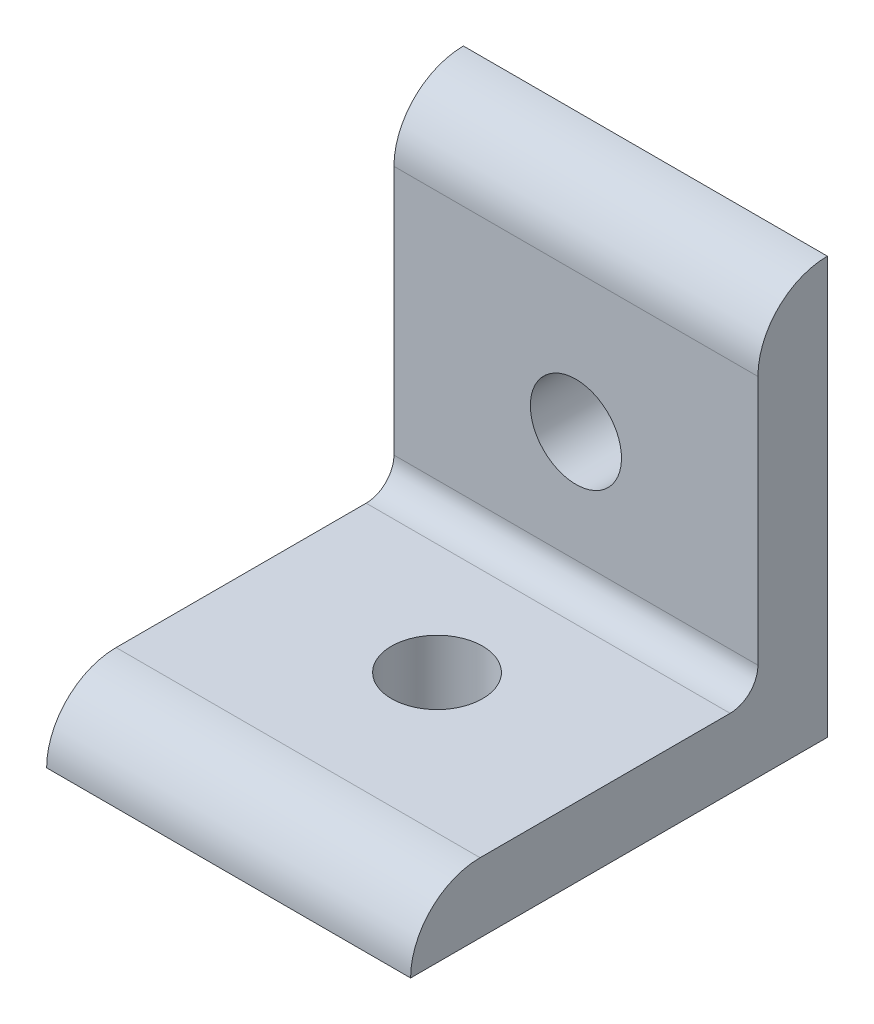
ISO-10303-21;
HEADER;
FILE_DESCRIPTION(('STEP AP214'),'2;1');
FILE_NAME('part.step','',(''),(''),'','','');
FILE_SCHEMA(('AUTOMOTIVE_DESIGN { 1 0 10303 214 1 1 1 1 }'));
ENDSEC;
DATA;
#1=APPLICATION_CONTEXT('core data for automotive mechanical design processes');
#2=APPLICATION_PROTOCOL_DEFINITION('international standard','automotive_design',2000,#1);
#3=PRODUCT_CONTEXT('',#1,'mechanical');
#4=PRODUCT('Part','Part','',(#3));
#5=PRODUCT_RELATED_PRODUCT_CATEGORY('part','',(#4));
#6=PRODUCT_DEFINITION_FORMATION('','',#4);
#7=PRODUCT_DEFINITION_CONTEXT('part definition',#1,'design');
#8=PRODUCT_DEFINITION('design','',#6,#7);
#9=PRODUCT_DEFINITION_SHAPE('','',#8);
#10=(LENGTH_UNIT() NAMED_UNIT(*) SI_UNIT(.MILLI.,.METRE.));
#11=(NAMED_UNIT(*) PLANE_ANGLE_UNIT() SI_UNIT($,.RADIAN.));
#12=(NAMED_UNIT(*) SI_UNIT($,.STERADIAN.) SOLID_ANGLE_UNIT());
#13=UNCERTAINTY_MEASURE_WITH_UNIT(LENGTH_MEASURE(1.E-05),#10,'distance_accuracy_value','');
#14=(GEOMETRIC_REPRESENTATION_CONTEXT(3) GLOBAL_UNCERTAINTY_ASSIGNED_CONTEXT((#13)) GLOBAL_UNIT_ASSIGNED_CONTEXT((#10,
#11,#12)) REPRESENTATION_CONTEXT('',''));
#15=CARTESIAN_POINT('',(0.,0.,0.));
#16=DIRECTION('',(0.,0.,1.));
#17=DIRECTION('',(1.,0.,0.));
#18=AXIS2_PLACEMENT_3D('',#15,#16,#17);
#19=CARTESIAN_POINT('',(-16.6178382583052,8.81215661344187,8.95617811660636));
#20=DIRECTION('',(1.,0.,0.));
#21=DIRECTION('',(0.,0.,-1.));
#22=AXIS2_PLACEMENT_3D('',#19,#20,#21);
#23=CYLINDRICAL_SURFACE('',#22,2.54);
#24=DIRECTION('',(1.,0.,0.));
#25=VECTOR('',#24,1.);
#26=CARTESIAN_POINT('',(-16.6178382583052,8.81215661344188,6.41617811660636));
#27=LINE('',#26,#25);
#28=CARTESIAN_POINT('',(-16.6178382583052,8.81215661344187,6.41617811660636));
#29=VERTEX_POINT('',#28);
#30=CARTESIAN_POINT('',(16.6561617416948,8.81215661344187,6.41617811660636));
#31=VERTEX_POINT('',#30);
#32=EDGE_CURVE('E10',#29,#31,#27,.T.);
#33=ORIENTED_EDGE('',*,*,#32,.F.);
#34=CARTESIAN_POINT('',(-16.6178382583052,8.81215661344187,8.95617811660636));
#35=DIRECTION('',(1.,0.,0.));
#36=DIRECTION('',(0.,0.,-1.));
#37=AXIS2_PLACEMENT_3D('',#34,#35,#36);
#38=CIRCLE('',#37,2.54);
#39=CARTESIAN_POINT('',(-16.6178382583052,6.27215661344187,8.95617811660636));
#40=VERTEX_POINT('',#39);
#41=EDGE_CURVE('E154',#40,#29,#38,.T.);
#42=ORIENTED_EDGE('',*,*,#41,.F.);
#43=DIRECTION('',(-1.,0.,0.));
#44=VECTOR('',#43,1.);
#45=CARTESIAN_POINT('',(-16.6178382583052,6.27215661344187,8.95617811660636));
#46=LINE('',#45,#44);
#47=CARTESIAN_POINT('',(16.6561617416948,6.27215661344187,8.95617811660636));
#48=VERTEX_POINT('',#47);
#49=EDGE_CURVE('E26',#48,#40,#46,.T.);
#50=ORIENTED_EDGE('',*,*,#49,.F.);
#51=CARTESIAN_POINT('',(16.6561617416948,8.81215661344187,8.95617811660636));
#52=DIRECTION('',(1.,0.,0.));
#53=DIRECTION('',(0.,0.,-1.));
#54=AXIS2_PLACEMENT_3D('',#51,#52,#53);
#55=CIRCLE('',#54,2.54);
#56=EDGE_CURVE('E140',#48,#31,#55,.T.);
#57=ORIENTED_EDGE('',*,*,#56,.T.);
#58=EDGE_LOOP('',(#33,#42,#50,#57));
#59=FACE_BOUND('',#58,.T.);
#60=ADVANCED_FACE('F16',(#59),#23,.F.);
#61=CARTESIAN_POINT('',(-16.6178382583052,8.81215661344188,6.41617811660636));
#62=DIRECTION('',(0.,0.,1.));
#63=DIRECTION('',(0.,-1.,0.));
#64=AXIS2_PLACEMENT_3D('',#61,#62,#63);
#65=PLANE('',#64);
#66=CARTESIAN_POINT('',(0.019161741694791,18.9721566134419,6.4161781166064));
#67=DIRECTION('',(0.,0.,-1.));
#68=DIRECTION('',(0.,1.,0.));
#69=AXIS2_PLACEMENT_3D('',#66,#67,#68);
#70=CIRCLE('',#69,4.1656);
#71=CARTESIAN_POINT('',(0.019161741694791,23.1377566134418,6.41617811660642));
#72=VERTEX_POINT('',#71);
#73=EDGE_CURVE('E169',#72,#72,#70,.T.);
#74=ORIENTED_EDGE('',*,*,#73,.T.);
#75=EDGE_LOOP('',(#74));
#76=FACE_BOUND('',#75,.T.);
#77=DIRECTION('',(0.,1.,0.));
#78=VECTOR('',#77,1.);
#79=CARTESIAN_POINT('',(-16.6178382583052,8.81215661344187,6.41617811660636));
#80=LINE('',#79,#78);
#81=CARTESIAN_POINT('',(-16.6178382583052,31.6721566134419,6.41617811660641));
#82=VERTEX_POINT('',#81);
#83=EDGE_CURVE('E145',#29,#82,#80,.T.);
#84=ORIENTED_EDGE('',*,*,#83,.F.);
#85=ORIENTED_EDGE('',*,*,#32,.T.);
#86=DIRECTION('',(0.,1.,0.));
#87=VECTOR('',#86,1.);
#88=CARTESIAN_POINT('',(16.6561617416948,8.81215661344187,6.41617811660636));
#89=LINE('',#88,#87);
#90=CARTESIAN_POINT('',(16.6561617416948,31.6721566134419,6.41617811660641));
#91=VERTEX_POINT('',#90);
#92=EDGE_CURVE('E146',#31,#91,#89,.T.);
#93=ORIENTED_EDGE('',*,*,#92,.T.);
#94=DIRECTION('',(1.,0.,0.));
#95=VECTOR('',#94,1.);
#96=CARTESIAN_POINT('',(-16.6178382583052,31.6721566134419,6.41617811660645));
#97=LINE('',#96,#95);
#98=EDGE_CURVE('E138',#82,#91,#97,.T.);
#99=ORIENTED_EDGE('',*,*,#98,.F.);
#100=EDGE_LOOP('',(#84,#85,#93,#99));
#101=FACE_BOUND('',#100,.T.);
#102=ADVANCED_FACE('F228',(#76,#101),#65,.T.);
#103=CARTESIAN_POINT('',(-16.6178382583052,6.27215661344187,31.8161781166063));
#104=DIRECTION('',(0.,1.,0.));
#105=DIRECTION('',(1.,0.,0.));
#106=AXIS2_PLACEMENT_3D('',#103,#104,#105);
#107=PLANE('',#106);
#108=CARTESIAN_POINT('',(0.019161741694791,6.27215661344187,19.1161781166063));
#109=DIRECTION('',(0.,-1.,0.));
#110=DIRECTION('',(0.,0.,-1.));
#111=AXIS2_PLACEMENT_3D('',#108,#109,#110);
#112=CIRCLE('',#111,4.1656);
#113=CARTESIAN_POINT('',(0.019161741694791,6.27215661344187,14.9505781166063));
#114=VERTEX_POINT('',#113);
#115=EDGE_CURVE('E170',#114,#114,#112,.T.);
#116=ORIENTED_EDGE('',*,*,#115,.T.);
#117=EDGE_LOOP('',(#116));
#118=FACE_BOUND('',#117,.T.);
#119=DIRECTION('',(0.,0.,-1.));
#120=VECTOR('',#119,1.);
#121=CARTESIAN_POINT('',(-16.6178382583052,6.27215661344187,8.95617811660636));
#122=LINE('',#121,#120);
#123=CARTESIAN_POINT('',(-16.6178382583052,6.27215661344187,31.8161781166063));
#124=VERTEX_POINT('',#123);
#125=EDGE_CURVE('E150',#124,#40,#122,.T.);
#126=ORIENTED_EDGE('',*,*,#125,.F.);
#127=DIRECTION('',(-1.,0.,0.));
#128=VECTOR('',#127,1.);
#129=CARTESIAN_POINT('',(-16.6178382583052,6.27215661344187,31.8161781166063));
#130=LINE('',#129,#128);
#131=CARTESIAN_POINT('',(16.6561617416948,6.27215661344187,31.8161781166063));
#132=VERTEX_POINT('',#131);
#133=EDGE_CURVE('E162',#132,#124,#130,.T.);
#134=ORIENTED_EDGE('',*,*,#133,.F.);
#135=DIRECTION('',(0.,0.,-1.));
#136=VECTOR('',#135,1.);
#137=CARTESIAN_POINT('',(16.6561617416948,6.27215661344187,8.95617811660636));
#138=LINE('',#137,#136);
#139=EDGE_CURVE('E158',#132,#48,#138,.T.);
#140=ORIENTED_EDGE('',*,*,#139,.T.);
#141=ORIENTED_EDGE('',*,*,#49,.T.);
#142=EDGE_LOOP('',(#126,#134,#140,#141));
#143=FACE_BOUND('',#142,.T.);
#144=ADVANCED_FACE('F197',(#118,#143),#107,.T.);
#145=CARTESIAN_POINT('',(-16.6178382583052,31.6721566134419,0.0661781166064482));
#146=DIRECTION('',(1.,0.,0.));
#147=DIRECTION('',(0.,0.,-1.));
#148=AXIS2_PLACEMENT_3D('',#145,#146,#147);
#149=CYLINDRICAL_SURFACE('',#148,6.35);
#150=CARTESIAN_POINT('',(-16.6178382583052,31.6721566134419,0.0661781166064482));
#151=DIRECTION('',(-1.,0.,0.));
#152=DIRECTION('',(0.,0.,-1.));
#153=AXIS2_PLACEMENT_3D('',#150,#151,#152);
#154=CIRCLE('',#153,6.35);
#155=CARTESIAN_POINT('',(-16.6178382583052,38.0221566134419,0.0661781166064754));
#156=VERTEX_POINT('',#155);
#157=EDGE_CURVE('E141',#82,#156,#154,.T.);
#158=ORIENTED_EDGE('',*,*,#157,.F.);
#159=ORIENTED_EDGE('',*,*,#98,.T.);
#160=CARTESIAN_POINT('',(16.6561617416948,31.6721566134419,0.0661781166064482));
#161=DIRECTION('',(-1.,0.,0.));
#162=DIRECTION('',(0.,0.,-1.));
#163=AXIS2_PLACEMENT_3D('',#160,#161,#162);
#164=CIRCLE('',#163,6.35);
#165=CARTESIAN_POINT('',(16.6561617416948,38.0221566134419,0.0661781166064754));
#166=VERTEX_POINT('',#165);
#167=EDGE_CURVE('E149',#91,#166,#164,.T.);
#168=ORIENTED_EDGE('',*,*,#167,.T.);
#169=DIRECTION('',(1.,0.,0.));
#170=VECTOR('',#169,1.);
#171=CARTESIAN_POINT('',(-16.6178382583052,38.0221566134419,0.0661781166064754));
#172=LINE('',#171,#170);
#173=EDGE_CURVE('E97',#156,#166,#172,.T.);
#174=ORIENTED_EDGE('',*,*,#173,.F.);
#175=EDGE_LOOP('',(#158,#159,#168,#174));
#176=FACE_BOUND('',#175,.T.);
#177=ADVANCED_FACE('F226',(#176),#149,.T.);
#178=CARTESIAN_POINT('',(16.6561617416948,8.81215661344187,8.95617811660636));
#179=DIRECTION('',(-1.,0.,0.));
#180=DIRECTION('',(0.,0.,1.));
#181=AXIS2_PLACEMENT_3D('',#178,#179,#180);
#182=PLANE('',#181);
#183=ORIENTED_EDGE('',*,*,#139,.F.);
#184=CARTESIAN_POINT('',(16.6561617416948,-0.0778433865581301,31.8161781166063));
#185=DIRECTION('',(-1.,0.,0.));
#186=DIRECTION('',(0.,0.,-1.));
#187=AXIS2_PLACEMENT_3D('',#184,#185,#186);
#188=CIRCLE('',#187,6.35);
#189=CARTESIAN_POINT('',(16.6561617416948,-0.0778433865581301,38.1661781166064));
#190=VERTEX_POINT('',#189);
#191=EDGE_CURVE('E108',#190,#132,#188,.T.);
#192=ORIENTED_EDGE('',*,*,#191,.F.);
#193=DIRECTION('',(0.,0.,1.));
#194=VECTOR('',#193,1.);
#195=CARTESIAN_POINT('',(16.6561617416948,-0.0778433865581301,38.1661781166064));
#196=LINE('',#195,#194);
#197=CARTESIAN_POINT('',(16.6561617416948,-0.0778433865581301,0.0661781166063284));
#198=VERTEX_POINT('',#197);
#199=EDGE_CURVE('E104',#198,#190,#196,.T.);
#200=ORIENTED_EDGE('',*,*,#199,.F.);
#201=DIRECTION('',(0.,-1.,0.));
#202=VECTOR('',#201,1.);
#203=CARTESIAN_POINT('',(16.6561617416948,38.0221566134419,0.0661781166064754));
#204=LINE('',#203,#202);
#205=EDGE_CURVE('E89',#166,#198,#204,.T.);
#206=ORIENTED_EDGE('',*,*,#205,.F.);
#207=ORIENTED_EDGE('',*,*,#167,.F.);
#208=ORIENTED_EDGE('',*,*,#92,.F.);
#209=ORIENTED_EDGE('',*,*,#56,.F.);
#210=EDGE_LOOP('',(#183,#192,#200,#206,#207,#208,#209));
#211=FACE_BOUND('',#210,.T.);
#212=ADVANCED_FACE('F106',(#211),#182,.F.);
#213=CARTESIAN_POINT('',(-16.6178382583052,-0.0778433865581301,31.8161781166063));
#214=DIRECTION('',(1.,0.,0.));
#215=DIRECTION('',(0.,0.,-1.));
#216=AXIS2_PLACEMENT_3D('',#213,#214,#215);
#217=CYLINDRICAL_SURFACE('',#216,6.35);
#218=CARTESIAN_POINT('',(-16.6178382583052,-0.0778433865581301,31.8161781166063));
#219=DIRECTION('',(-1.,0.,0.));
#220=DIRECTION('',(0.,0.,-1.));
#221=AXIS2_PLACEMENT_3D('',#218,#219,#220);
#222=CIRCLE('',#221,6.35);
#223=CARTESIAN_POINT('',(-16.6178382583052,-0.0778433865581301,38.1661781166064));
#224=VERTEX_POINT('',#223);
#225=EDGE_CURVE('E101',#224,#124,#222,.T.);
#226=ORIENTED_EDGE('',*,*,#225,.F.);
#227=DIRECTION('',(-1.,0.,0.));
#228=VECTOR('',#227,1.);
#229=CARTESIAN_POINT('',(-16.6178382583052,-0.0778433865581301,38.1661781166064));
#230=LINE('',#229,#228);
#231=EDGE_CURVE('E113',#190,#224,#230,.T.);
#232=ORIENTED_EDGE('',*,*,#231,.F.);
#233=ORIENTED_EDGE('',*,*,#191,.T.);
#234=ORIENTED_EDGE('',*,*,#133,.T.);
#235=EDGE_LOOP('',(#226,#232,#233,#234));
#236=FACE_BOUND('',#235,.T.);
#237=ADVANCED_FACE('F205',(#236),#217,.T.);
#238=CARTESIAN_POINT('',(-16.6178382583052,8.81215661344187,8.95617811660636));
#239=DIRECTION('',(-1.,0.,0.));
#240=DIRECTION('',(0.,0.,1.));
#241=AXIS2_PLACEMENT_3D('',#238,#239,#240);
#242=PLANE('',#241);
#243=ORIENTED_EDGE('',*,*,#225,.T.);
#244=ORIENTED_EDGE('',*,*,#125,.T.);
#245=ORIENTED_EDGE('',*,*,#41,.T.);
#246=ORIENTED_EDGE('',*,*,#83,.T.);
#247=ORIENTED_EDGE('',*,*,#157,.T.);
#248=DIRECTION('',(0.,1.,0.));
#249=VECTOR('',#248,1.);
#250=CARTESIAN_POINT('',(-16.6178382583052,38.0221566134419,0.0661781166064754));
#251=LINE('',#250,#249);
#252=CARTESIAN_POINT('',(-16.6178382583052,-0.0778433865581301,0.0661781166063284));
#253=VERTEX_POINT('',#252);
#254=EDGE_CURVE('E19',#253,#156,#251,.T.);
#255=ORIENTED_EDGE('',*,*,#254,.F.);
#256=DIRECTION('',(0.,0.,-1.));
#257=VECTOR('',#256,1.);
#258=CARTESIAN_POINT('',(-16.6178382583052,-0.0778433865581301,38.1661781166064));
#259=LINE('',#258,#257);
#260=EDGE_CURVE('E117',#224,#253,#259,.T.);
#261=ORIENTED_EDGE('',*,*,#260,.F.);
#262=EDGE_LOOP('',(#243,#244,#245,#246,#247,#255,#261));
#263=FACE_BOUND('',#262,.T.);
#264=ADVANCED_FACE('F202',(#263),#242,.T.);
#265=CARTESIAN_POINT('',(-16.6178382583052,38.0221566134419,0.0661781166064754));
#266=DIRECTION('',(0.,0.,-1.));
#267=DIRECTION('',(-1.,0.,0.));
#268=AXIS2_PLACEMENT_3D('',#265,#266,#267);
#269=PLANE('',#268);
#270=CARTESIAN_POINT('',(0.019161741694791,18.9721566134419,0.0661781166064047));
#271=DIRECTION('',(0.,0.,1.));
#272=DIRECTION('',(0.,1.,0.));
#273=AXIS2_PLACEMENT_3D('',#270,#271,#272);
#274=CIRCLE('',#273,4.1656);
#275=CARTESIAN_POINT('',(0.019161741694791,23.1377566134418,0.0661781166064208));
#276=VERTEX_POINT('',#275);
#277=EDGE_CURVE('E124',#276,#276,#274,.T.);
#278=ORIENTED_EDGE('',*,*,#277,.T.);
#279=EDGE_LOOP('',(#278));
#280=FACE_BOUND('',#279,.T.);
#281=ORIENTED_EDGE('',*,*,#254,.T.);
#282=ORIENTED_EDGE('',*,*,#173,.T.);
#283=ORIENTED_EDGE('',*,*,#205,.T.);
#284=DIRECTION('',(1.,0.,0.));
#285=VECTOR('',#284,1.);
#286=CARTESIAN_POINT('',(-16.6178382583052,-0.0778433865581301,0.0661781166063284));
#287=LINE('',#286,#285);
#288=EDGE_CURVE('E94',#253,#198,#287,.T.);
#289=ORIENTED_EDGE('',*,*,#288,.F.);
#290=EDGE_LOOP('',(#281,#282,#283,#289));
#291=FACE_BOUND('',#290,.T.);
#292=ADVANCED_FACE('F92',(#280,#291),#269,.T.);
#293=CARTESIAN_POINT('',(-16.6178382583052,-0.0778433865581301,38.1661781166064));
#294=DIRECTION('',(0.,-1.,0.));
#295=DIRECTION('',(0.,0.,-1.));
#296=AXIS2_PLACEMENT_3D('',#293,#294,#295);
#297=PLANE('',#296);
#298=CARTESIAN_POINT('',(0.019161741694791,-0.0778433865581301,19.1161781166063));
#299=DIRECTION('',(0.,1.,0.));
#300=DIRECTION('',(0.,0.,-1.));
#301=AXIS2_PLACEMENT_3D('',#298,#299,#300);
#302=CIRCLE('',#301,4.1656);
#303=CARTESIAN_POINT('',(0.019161741694791,-0.0778433865581301,14.9505781166063));
#304=VERTEX_POINT('',#303);
#305=EDGE_CURVE('E166',#304,#304,#302,.T.);
#306=ORIENTED_EDGE('',*,*,#305,.T.);
#307=EDGE_LOOP('',(#306));
#308=FACE_BOUND('',#307,.T.);
#309=ORIENTED_EDGE('',*,*,#260,.T.);
#310=ORIENTED_EDGE('',*,*,#288,.T.);
#311=ORIENTED_EDGE('',*,*,#199,.T.);
#312=ORIENTED_EDGE('',*,*,#231,.T.);
#313=EDGE_LOOP('',(#309,#310,#311,#312));
#314=FACE_BOUND('',#313,.T.);
#315=ADVANCED_FACE('F115',(#308,#314),#297,.T.);
#316=CARTESIAN_POINT('',(0.019161741694791,18.9721566134417,38.1661781166064));
#317=DIRECTION('',(0.,0.,-1.));
#318=DIRECTION('',(0.,1.,0.));
#319=AXIS2_PLACEMENT_3D('',#316,#317,#318);
#320=CYLINDRICAL_SURFACE('',#319,4.1656);
#321=ORIENTED_EDGE('',*,*,#277,.F.);
#322=EDGE_LOOP('',(#321));
#323=FACE_BOUND('',#322,.T.);
#324=ORIENTED_EDGE('',*,*,#73,.F.);
#325=EDGE_LOOP('',(#324));
#326=FACE_BOUND('',#325,.T.);
#327=ADVANCED_FACE('F242',(#323,#326),#320,.F.);
#328=CARTESIAN_POINT('',(0.019161741694791,38.0221566134419,19.1161781166063));
#329=DIRECTION('',(0.,-1.,0.));
#330=DIRECTION('',(0.,0.,-1.));
#331=AXIS2_PLACEMENT_3D('',#328,#329,#330);
#332=CYLINDRICAL_SURFACE('',#331,4.1656);
#333=ORIENTED_EDGE('',*,*,#305,.F.);
#334=EDGE_LOOP('',(#333));
#335=FACE_BOUND('',#334,.T.);
#336=ORIENTED_EDGE('',*,*,#115,.F.);
#337=EDGE_LOOP('',(#336));
#338=FACE_BOUND('',#337,.T.);
#339=ADVANCED_FACE('F239',(#335,#338),#332,.F.);
#340=CLOSED_SHELL('',(#60,#102,#144,#177,#212,#237,#264,#292,#315,#327,#339));
#341=MANIFOLD_SOLID_BREP('B1',#340);
#342=ADVANCED_BREP_SHAPE_REPRESENTATION('',(#18,#341),#14);
#343=SHAPE_DEFINITION_REPRESENTATION(#9,#342);
ENDSEC;
END-ISO-10303-21;
